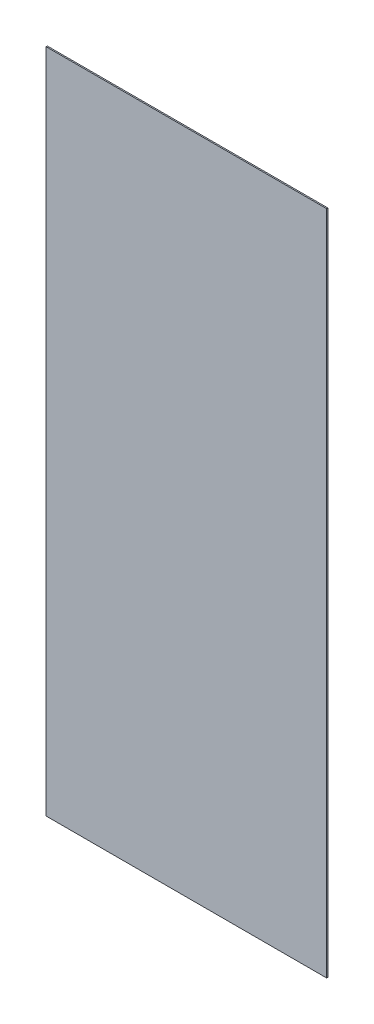
ISO-10303-21;
HEADER;
FILE_DESCRIPTION(('STEP AP214'),'2;1');
FILE_NAME('part.step','',(''),(''),'','','');
FILE_SCHEMA(('AUTOMOTIVE_DESIGN { 1 0 10303 214 1 1 1 1 }'));
ENDSEC;
DATA;
#1=APPLICATION_CONTEXT('core data for automotive mechanical design processes');
#2=APPLICATION_PROTOCOL_DEFINITION('international standard','automotive_design',2000,#1);
#3=PRODUCT_CONTEXT('',#1,'mechanical');
#4=PRODUCT('Part','Part','',(#3));
#5=PRODUCT_RELATED_PRODUCT_CATEGORY('part','',(#4));
#6=PRODUCT_DEFINITION_FORMATION('','',#4);
#7=PRODUCT_DEFINITION_CONTEXT('part definition',#1,'design');
#8=PRODUCT_DEFINITION('design','',#6,#7);
#9=PRODUCT_DEFINITION_SHAPE('','',#8);
#10=(LENGTH_UNIT() NAMED_UNIT(*) SI_UNIT(.MILLI.,.METRE.));
#11=(NAMED_UNIT(*) PLANE_ANGLE_UNIT() SI_UNIT($,.RADIAN.));
#12=(NAMED_UNIT(*) SI_UNIT($,.STERADIAN.) SOLID_ANGLE_UNIT());
#13=UNCERTAINTY_MEASURE_WITH_UNIT(LENGTH_MEASURE(1.E-05),#10,'distance_accuracy_value','');
#14=(GEOMETRIC_REPRESENTATION_CONTEXT(3) GLOBAL_UNCERTAINTY_ASSIGNED_CONTEXT((#13)) GLOBAL_UNIT_ASSIGNED_CONTEXT((#10,
#11,#12)) REPRESENTATION_CONTEXT('',''));
#15=CARTESIAN_POINT('',(0.,0.,0.));
#16=DIRECTION('',(0.,0.,1.));
#17=DIRECTION('',(1.,0.,0.));
#18=AXIS2_PLACEMENT_3D('',#15,#16,#17);
#19=CARTESIAN_POINT('',(101.6,241.3,0.9));
#20=DIRECTION('',(-1.,0.,0.));
#21=DIRECTION('',(0.,-1.,0.));
#22=AXIS2_PLACEMENT_3D('',#19,#20,#21);
#23=PLANE('',#22);
#24=DIRECTION('',(0.,1.,0.));
#25=VECTOR('',#24,1.);
#26=CARTESIAN_POINT('',(101.6,241.3,0.));
#27=LINE('',#26,#25);
#28=CARTESIAN_POINT('',(101.6,-241.3,0.));
#29=VERTEX_POINT('',#28);
#30=CARTESIAN_POINT('',(101.6,241.3,0.));
#31=VERTEX_POINT('',#30);
#32=EDGE_CURVE('E107',#29,#31,#27,.T.);
#33=ORIENTED_EDGE('',*,*,#32,.T.);
#34=DIRECTION('',(0.,0.,-1.));
#35=VECTOR('',#34,1.);
#36=CARTESIAN_POINT('',(101.6,241.3,0.9));
#37=LINE('',#36,#35);
#38=CARTESIAN_POINT('',(101.6,241.3,0.9));
#39=VERTEX_POINT('',#38);
#40=EDGE_CURVE('E11',#39,#31,#37,.T.);
#41=ORIENTED_EDGE('',*,*,#40,.F.);
#42=DIRECTION('',(0.,1.,0.));
#43=VECTOR('',#42,1.);
#44=CARTESIAN_POINT('',(101.6,241.3,0.9));
#45=LINE('',#44,#43);
#46=CARTESIAN_POINT('',(101.6,-241.3,0.9));
#47=VERTEX_POINT('',#46);
#48=EDGE_CURVE('E91',#47,#39,#45,.T.);
#49=ORIENTED_EDGE('',*,*,#48,.F.);
#50=DIRECTION('',(0.,0.,-1.));
#51=VECTOR('',#50,1.);
#52=CARTESIAN_POINT('',(101.6,-241.3,0.9));
#53=LINE('',#52,#51);
#54=EDGE_CURVE('E103',#47,#29,#53,.T.);
#55=ORIENTED_EDGE('',*,*,#54,.T.);
#56=EDGE_LOOP('',(#33,#41,#49,#55));
#57=FACE_BOUND('',#56,.T.);
#58=ADVANCED_FACE('F39',(#57),#23,.F.);
#59=CARTESIAN_POINT('',(-101.6,241.3,0.9));
#60=DIRECTION('',(0.,-1.,0.));
#61=DIRECTION('',(0.,0.,-1.));
#62=AXIS2_PLACEMENT_3D('',#59,#60,#61);
#63=PLANE('',#62);
#64=DIRECTION('',(-1.,0.,0.));
#65=VECTOR('',#64,1.);
#66=CARTESIAN_POINT('',(-101.6,241.3,0.));
#67=LINE('',#66,#65);
#68=CARTESIAN_POINT('',(-101.6,241.3,0.));
#69=VERTEX_POINT('',#68);
#70=EDGE_CURVE('E96',#31,#69,#67,.T.);
#71=ORIENTED_EDGE('',*,*,#70,.T.);
#72=DIRECTION('',(0.,0.,-1.));
#73=VECTOR('',#72,1.);
#74=CARTESIAN_POINT('',(-101.6,241.3,0.9));
#75=LINE('',#74,#73);
#76=CARTESIAN_POINT('',(-101.6,241.3,0.9));
#77=VERTEX_POINT('',#76);
#78=EDGE_CURVE('E48',#77,#69,#75,.T.);
#79=ORIENTED_EDGE('',*,*,#78,.F.);
#80=DIRECTION('',(-1.,0.,0.));
#81=VECTOR('',#80,1.);
#82=CARTESIAN_POINT('',(-101.6,241.3,0.9));
#83=LINE('',#82,#81);
#84=EDGE_CURVE('E86',#39,#77,#83,.T.);
#85=ORIENTED_EDGE('',*,*,#84,.F.);
#86=ORIENTED_EDGE('',*,*,#40,.T.);
#87=EDGE_LOOP('',(#71,#79,#85,#86));
#88=FACE_BOUND('',#87,.T.);
#89=ADVANCED_FACE('F95',(#88),#63,.F.);
#90=CARTESIAN_POINT('',(-101.6,241.3,0.9));
#91=DIRECTION('',(1.,0.,0.));
#92=DIRECTION('',(0.,1.,0.));
#93=AXIS2_PLACEMENT_3D('',#90,#91,#92);
#94=PLANE('',#93);
#95=DIRECTION('',(0.,-1.,0.));
#96=VECTOR('',#95,1.);
#97=CARTESIAN_POINT('',(-101.6,241.3,0.));
#98=LINE('',#97,#96);
#99=CARTESIAN_POINT('',(-101.6,-241.3,0.));
#100=VERTEX_POINT('',#99);
#101=EDGE_CURVE('E73',#69,#100,#98,.T.);
#102=ORIENTED_EDGE('',*,*,#101,.T.);
#103=DIRECTION('',(0.,0.,-1.));
#104=VECTOR('',#103,1.);
#105=CARTESIAN_POINT('',(-101.6,-241.3,0.9));
#106=LINE('',#105,#104);
#107=CARTESIAN_POINT('',(-101.6,-241.3,0.9));
#108=VERTEX_POINT('',#107);
#109=EDGE_CURVE('E98',#108,#100,#106,.T.);
#110=ORIENTED_EDGE('',*,*,#109,.F.);
#111=DIRECTION('',(0.,-1.,0.));
#112=VECTOR('',#111,1.);
#113=CARTESIAN_POINT('',(-101.6,241.3,0.9));
#114=LINE('',#113,#112);
#115=EDGE_CURVE('E89',#77,#108,#114,.T.);
#116=ORIENTED_EDGE('',*,*,#115,.F.);
#117=ORIENTED_EDGE('',*,*,#78,.T.);
#118=EDGE_LOOP('',(#102,#110,#116,#117));
#119=FACE_BOUND('',#118,.T.);
#120=ADVANCED_FACE('F99',(#119),#94,.F.);
#121=CARTESIAN_POINT('',(-101.6,-241.3,0.9));
#122=DIRECTION('',(0.,1.,0.));
#123=DIRECTION('',(0.,0.,1.));
#124=AXIS2_PLACEMENT_3D('',#121,#122,#123);
#125=PLANE('',#124);
#126=DIRECTION('',(1.,0.,0.));
#127=VECTOR('',#126,1.);
#128=CARTESIAN_POINT('',(-101.6,-241.3,0.));
#129=LINE('',#128,#127);
#130=EDGE_CURVE('E79',#100,#29,#129,.T.);
#131=ORIENTED_EDGE('',*,*,#130,.T.);
#132=ORIENTED_EDGE('',*,*,#54,.F.);
#133=DIRECTION('',(1.,0.,0.));
#134=VECTOR('',#133,1.);
#135=CARTESIAN_POINT('',(-101.6,-241.3,0.9));
#136=LINE('',#135,#134);
#137=EDGE_CURVE('E56',#108,#47,#136,.T.);
#138=ORIENTED_EDGE('',*,*,#137,.F.);
#139=ORIENTED_EDGE('',*,*,#109,.T.);
#140=EDGE_LOOP('',(#131,#132,#138,#139));
#141=FACE_BOUND('',#140,.T.);
#142=ADVANCED_FACE('F120',(#141),#125,.F.);
#143=CARTESIAN_POINT('',(0.,0.,0.9));
#144=DIRECTION('',(0.,0.,1.));
#145=DIRECTION('',(1.,0.,0.));
#146=AXIS2_PLACEMENT_3D('',#143,#144,#145);
#147=PLANE('',#146);
#148=ORIENTED_EDGE('',*,*,#48,.T.);
#149=ORIENTED_EDGE('',*,*,#84,.T.);
#150=ORIENTED_EDGE('',*,*,#115,.T.);
#151=ORIENTED_EDGE('',*,*,#137,.T.);
#152=EDGE_LOOP('',(#148,#149,#150,#151));
#153=FACE_BOUND('',#152,.T.);
#154=ADVANCED_FACE('F87',(#153),#147,.T.);
#155=CARTESIAN_POINT('',(0.,0.,0.));
#156=DIRECTION('',(0.,0.,1.));
#157=DIRECTION('',(1.,0.,0.));
#158=AXIS2_PLACEMENT_3D('',#155,#156,#157);
#159=PLANE('',#158);
#160=ORIENTED_EDGE('',*,*,#32,.F.);
#161=ORIENTED_EDGE('',*,*,#130,.F.);
#162=ORIENTED_EDGE('',*,*,#101,.F.);
#163=ORIENTED_EDGE('',*,*,#70,.F.);
#164=EDGE_LOOP('',(#160,#161,#162,#163));
#165=FACE_BOUND('',#164,.T.);
#166=ADVANCED_FACE('F123',(#165),#159,.F.);
#167=CLOSED_SHELL('',(#58,#89,#120,#142,#154,#166));
#168=MANIFOLD_SOLID_BREP('B2',#167);
#169=ADVANCED_BREP_SHAPE_REPRESENTATION('',(#18,#168),#14);
#170=SHAPE_DEFINITION_REPRESENTATION(#9,#169);
ENDSEC;
END-ISO-10303-21;
